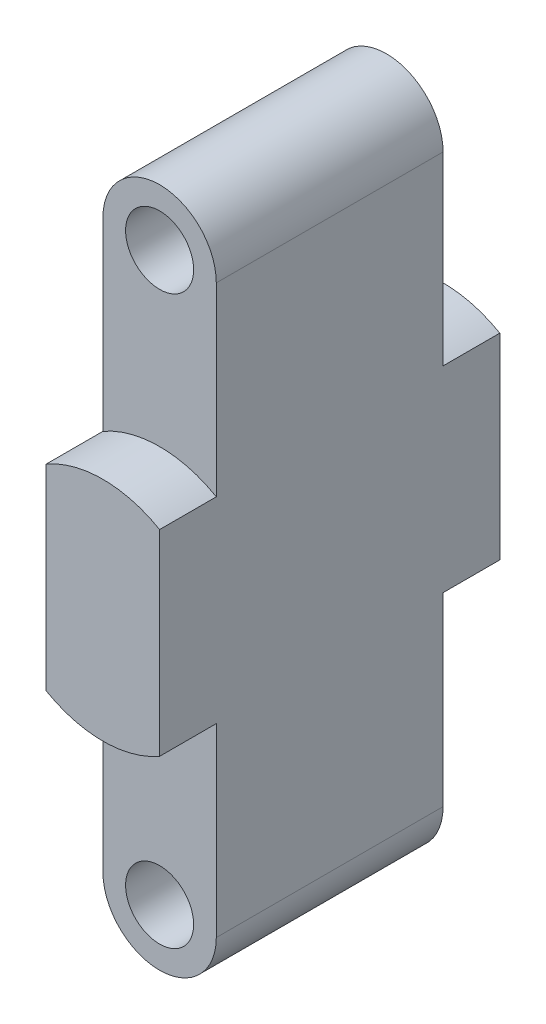
ISO-10303-21;
HEADER;
FILE_DESCRIPTION(('STEP AP214'),'2;1');
FILE_NAME('part.step','',(''),(''),'','','');
FILE_SCHEMA(('AUTOMOTIVE_DESIGN { 1 0 10303 214 1 1 1 1 }'));
ENDSEC;
DATA;
#1=APPLICATION_CONTEXT('core data for automotive mechanical design processes');
#2=APPLICATION_PROTOCOL_DEFINITION('international standard','automotive_design',2000,#1);
#3=PRODUCT_CONTEXT('',#1,'mechanical');
#4=PRODUCT('Part','Part','',(#3));
#5=PRODUCT_RELATED_PRODUCT_CATEGORY('part','',(#4));
#6=PRODUCT_DEFINITION_FORMATION('','',#4);
#7=PRODUCT_DEFINITION_CONTEXT('part definition',#1,'design');
#8=PRODUCT_DEFINITION('design','',#6,#7);
#9=PRODUCT_DEFINITION_SHAPE('','',#8);
#10=(LENGTH_UNIT() NAMED_UNIT(*) SI_UNIT(.MILLI.,.METRE.));
#11=(NAMED_UNIT(*) PLANE_ANGLE_UNIT() SI_UNIT($,.RADIAN.));
#12=(NAMED_UNIT(*) SI_UNIT($,.STERADIAN.) SOLID_ANGLE_UNIT());
#13=UNCERTAINTY_MEASURE_WITH_UNIT(LENGTH_MEASURE(1.E-05),#10,'distance_accuracy_value','');
#14=(GEOMETRIC_REPRESENTATION_CONTEXT(3) GLOBAL_UNCERTAINTY_ASSIGNED_CONTEXT((#13)) GLOBAL_UNIT_ASSIGNED_CONTEXT((#10,
#11,#12)) REPRESENTATION_CONTEXT('',''));
#15=CARTESIAN_POINT('',(0.,0.,0.));
#16=DIRECTION('',(0.,0.,1.));
#17=DIRECTION('',(1.,0.,0.));
#18=AXIS2_PLACEMENT_3D('',#15,#16,#17);
#19=CARTESIAN_POINT('',(0.,50.8,19.05));
#20=DIRECTION('',(0.,0.,-1.));
#21=DIRECTION('',(-1.,0.,0.));
#22=AXIS2_PLACEMENT_3D('',#19,#20,#21);
#23=CYLINDRICAL_SURFACE('',#22,6.35);
#24=DIRECTION('',(0.,0.,1.));
#25=VECTOR('',#24,1.);
#26=CARTESIAN_POINT('',(6.34999999999999,50.8,19.05));
#27=LINE('',#26,#25);
#28=CARTESIAN_POINT('',(6.34999999999999,50.8,-12.7));
#29=VERTEX_POINT('',#28);
#30=CARTESIAN_POINT('',(6.34999999999999,50.8,12.7));
#31=VERTEX_POINT('',#30);
#32=EDGE_CURVE('E45',#29,#31,#27,.T.);
#33=ORIENTED_EDGE('',*,*,#32,.F.);
#34=CARTESIAN_POINT('',(0.,50.8,-12.7));
#35=DIRECTION('',(0.,0.,-1.));
#36=DIRECTION('',(-1.,0.,0.));
#37=AXIS2_PLACEMENT_3D('',#34,#35,#36);
#38=CIRCLE('',#37,6.35);
#39=CARTESIAN_POINT('',(-6.35,50.8,-12.7));
#40=VERTEX_POINT('',#39);
#41=EDGE_CURVE('E257',#29,#40,#38,.F.);
#42=ORIENTED_EDGE('',*,*,#41,.T.);
#43=DIRECTION('',(0.,0.,1.));
#44=VECTOR('',#43,1.);
#45=CARTESIAN_POINT('',(-6.35,50.8,19.05));
#46=LINE('',#45,#44);
#47=CARTESIAN_POINT('',(-6.35,50.8,12.7));
#48=VERTEX_POINT('',#47);
#49=EDGE_CURVE('E168',#48,#40,#46,.F.);
#50=ORIENTED_EDGE('',*,*,#49,.F.);
#51=CARTESIAN_POINT('',(0.,50.8,12.7));
#52=DIRECTION('',(0.,0.,1.));
#53=DIRECTION('',(1.,0.,0.));
#54=AXIS2_PLACEMENT_3D('',#51,#52,#53);
#55=CIRCLE('',#54,6.35);
#56=EDGE_CURVE('E177',#48,#31,#55,.F.);
#57=ORIENTED_EDGE('',*,*,#56,.T.);
#58=EDGE_LOOP('',(#33,#42,#50,#57));
#59=FACE_BOUND('',#58,.T.);
#60=ADVANCED_FACE('F36',(#59),#23,.T.);
#61=CARTESIAN_POINT('',(0.,50.8,-19.05));
#62=DIRECTION('',(0.,0.,1.));
#63=DIRECTION('',(1.,0.,0.));
#64=AXIS2_PLACEMENT_3D('',#61,#62,#63);
#65=CYLINDRICAL_SURFACE('',#64,3.81);
#66=CARTESIAN_POINT('',(0.,50.8,12.7));
#67=DIRECTION('',(0.,0.,1.));
#68=DIRECTION('',(1.,0.,0.));
#69=AXIS2_PLACEMENT_3D('',#66,#67,#68);
#70=CIRCLE('',#69,3.81);
#71=CARTESIAN_POINT('',(3.81,50.8,12.7));
#72=VERTEX_POINT('',#71);
#73=EDGE_CURVE('E171',#72,#72,#70,.T.);
#74=CARTESIAN_POINT('',(0.,50.8,-12.7));
#75=DIRECTION('',(0.,0.,-1.));
#76=DIRECTION('',(-1.,0.,0.));
#77=AXIS2_PLACEMENT_3D('',#74,#75,#76);
#78=CIRCLE('',#77,3.81);
#79=CARTESIAN_POINT('',(3.81,50.8,-12.7));
#80=VERTEX_POINT('',#79);
#81=EDGE_CURVE('E40',#80,#80,#78,.T.);
#82=CARTESIAN_POINT('',(3.81,50.8,12.7));
#83=CARTESIAN_POINT('',(3.81,50.8,12.4354166666667));
#84=CARTESIAN_POINT('',(3.81,50.8,12.1708333333333));
#85=CARTESIAN_POINT('',(3.81,50.8,11.6416666666667));
#86=CARTESIAN_POINT('',(3.81,50.8,11.3770833333333));
#87=CARTESIAN_POINT('',(3.81,50.8,10.8479166666667));
#88=CARTESIAN_POINT('',(3.81,50.8,10.5833333333333));
#89=CARTESIAN_POINT('',(3.81,50.8,10.0541666666667));
#90=CARTESIAN_POINT('',(3.81,50.8,9.78958333333333));
#91=CARTESIAN_POINT('',(3.81,50.8,9.26041666666666));
#92=CARTESIAN_POINT('',(3.81,50.8,8.99583333333333));
#93=CARTESIAN_POINT('',(3.81,50.8,8.46666666666666));
#94=CARTESIAN_POINT('',(3.81,50.8,8.20208333333333));
#95=CARTESIAN_POINT('',(3.81,50.8,7.67291666666666));
#96=CARTESIAN_POINT('',(3.81,50.8,7.40833333333333));
#97=CARTESIAN_POINT('',(3.81,50.8,6.87916666666666));
#98=CARTESIAN_POINT('',(3.81,50.8,6.61458333333333));
#99=CARTESIAN_POINT('',(3.81,50.8,6.08541666666666));
#100=CARTESIAN_POINT('',(3.81,50.8,5.82083333333333));
#101=CARTESIAN_POINT('',(3.81,50.8,5.29166666666666));
#102=CARTESIAN_POINT('',(3.81,50.8,5.02708333333333));
#103=CARTESIAN_POINT('',(3.81,50.8,4.49791666666666));
#104=CARTESIAN_POINT('',(3.81,50.8,4.23333333333333));
#105=CARTESIAN_POINT('',(3.81,50.8,3.70416666666666));
#106=CARTESIAN_POINT('',(3.81,50.8,3.43958333333333));
#107=CARTESIAN_POINT('',(3.81,50.8,2.91041666666666));
#108=CARTESIAN_POINT('',(3.81,50.8,2.64583333333333));
#109=CARTESIAN_POINT('',(3.81,50.8,2.11666666666666));
#110=CARTESIAN_POINT('',(3.81,50.8,1.85208333333333));
#111=CARTESIAN_POINT('',(3.81,50.8,1.32291666666666));
#112=CARTESIAN_POINT('',(3.81,50.8,1.05833333333333));
#113=CARTESIAN_POINT('',(3.81,50.8,0.529166666666663));
#114=CARTESIAN_POINT('',(3.81,50.8,0.26458333333333));
#115=CARTESIAN_POINT('',(3.81,50.8,-0.264583333333337));
#116=CARTESIAN_POINT('',(3.81,50.8,-0.52916666666667));
#117=CARTESIAN_POINT('',(3.81,50.8,-1.05833333333334));
#118=CARTESIAN_POINT('',(3.81,50.8,-1.32291666666667));
#119=CARTESIAN_POINT('',(3.81,50.8,-1.85208333333334));
#120=CARTESIAN_POINT('',(3.81,50.8,-2.11666666666667));
#121=CARTESIAN_POINT('',(3.81,50.8,-2.64583333333334));
#122=CARTESIAN_POINT('',(3.81,50.8,-2.91041666666667));
#123=CARTESIAN_POINT('',(3.81,50.8,-3.43958333333334));
#124=CARTESIAN_POINT('',(3.81,50.8,-3.70416666666667));
#125=CARTESIAN_POINT('',(3.81,50.8,-4.23333333333333));
#126=CARTESIAN_POINT('',(3.81,50.8,-4.49791666666667));
#127=CARTESIAN_POINT('',(3.81,50.8,-5.02708333333333));
#128=CARTESIAN_POINT('',(3.81,50.8,-5.29166666666667));
#129=CARTESIAN_POINT('',(3.81,50.8,-5.82083333333333));
#130=CARTESIAN_POINT('',(3.81,50.8,-6.08541666666667));
#131=CARTESIAN_POINT('',(3.81,50.8,-6.61458333333333));
#132=CARTESIAN_POINT('',(3.81,50.8,-6.87916666666667));
#133=CARTESIAN_POINT('',(3.81,50.8,-7.40833333333333));
#134=CARTESIAN_POINT('',(3.81,50.8,-7.67291666666667));
#135=CARTESIAN_POINT('',(3.81,50.8,-8.20208333333334));
#136=CARTESIAN_POINT('',(3.81,50.8,-8.46666666666667));
#137=CARTESIAN_POINT('',(3.81,50.8,-8.99583333333334));
#138=CARTESIAN_POINT('',(3.81,50.8,-9.26041666666667));
#139=CARTESIAN_POINT('',(3.81,50.8,-9.78958333333333));
#140=CARTESIAN_POINT('',(3.81,50.8,-10.0541666666667));
#141=CARTESIAN_POINT('',(3.81,50.8,-10.5833333333333));
#142=CARTESIAN_POINT('',(3.81,50.8,-10.8479166666667));
#143=CARTESIAN_POINT('',(3.81,50.8,-11.3770833333333));
#144=CARTESIAN_POINT('',(3.81,50.8,-11.6416666666667));
#145=CARTESIAN_POINT('',(3.81,50.8,-12.1708333333333));
#146=CARTESIAN_POINT('',(3.81,50.8,-12.4354166666667));
#147=CARTESIAN_POINT('',(3.81,50.8,-12.7));
#148=B_SPLINE_CURVE_WITH_KNOTS('',3,(#82,#83,#84,#85,#86,#87,#88,#89,#90,#91,#92,#93,#94,#95,
#96,#97,#98,#99,#100,#101,#102,#103,#104,#105,#106,#107,#108,#109,#110,#111,#112,#113,#114,#115,
#116,#117,#118,#119,#120,#121,#122,#123,#124,#125,#126,#127,#128,#129,#130,#131,#132,#133,#134,
#135,#136,#137,#138,#139,#140,#141,#142,#143,#144,#145,#146,#147),.UNSPECIFIED.,.F.,.F.,(4,2,2,
2,2,2,2,2,2,2,2,2,2,2,2,2,2,2,2,2,2,2,2,2,2,2,2,2,2,2,2,2,4),(0.,0.793749999999996,1.5875,
2.38125,3.175,3.96875,4.7625,5.55625,6.35,7.14375,7.9375,8.73125,9.525,10.31875,11.1125,
11.90625,12.7,13.49375,14.2875,15.08125,15.875,16.66875,17.4625,18.25625,19.05,19.84375,20.6375,
21.43125,22.225,23.01875,23.8125,24.60625,25.4),.UNSPECIFIED.);
#149=EDGE_CURVE('BSEAM286',#72,#80,#148,.T.);
#150=ORIENTED_EDGE('',*,*,#73,.T.);
#151=ORIENTED_EDGE('',*,*,#81,.T.);
#152=ORIENTED_EDGE('',*,*,#149,.T.);
#153=ORIENTED_EDGE('',*,*,#149,.F.);
#154=EDGE_LOOP('',(#150,#152,#151,#153));
#155=FACE_BOUND('',#154,.T.);
#156=ADVANCED_FACE('F286',(#155),#65,.F.);
#157=CARTESIAN_POINT('',(0.,0.,-19.05));
#158=DIRECTION('',(0.,0.,1.));
#159=DIRECTION('',(1.,0.,0.));
#160=AXIS2_PLACEMENT_3D('',#157,#158,#159);
#161=PLANE('',#160);
#162=DIRECTION('',(0.,-1.,0.));
#163=VECTOR('',#162,1.);
#164=CARTESIAN_POINT('',(-6.35,19.05,-19.05));
#165=LINE('',#164,#163);
#166=CARTESIAN_POINT('',(-6.35,30.0485226280624,-19.05));
#167=VERTEX_POINT('',#166);
#168=CARTESIAN_POINT('',(-6.35,8.05147737193764,-19.05));
#169=VERTEX_POINT('',#168);
#170=EDGE_CURVE('E136',#167,#169,#165,.T.);
#171=ORIENTED_EDGE('',*,*,#170,.F.);
#172=CARTESIAN_POINT('',(0.,19.05,-19.05));
#173=DIRECTION('',(0.,0.,1.));
#174=DIRECTION('',(1.,0.,0.));
#175=AXIS2_PLACEMENT_3D('',#172,#173,#174);
#176=CIRCLE('',#175,12.7);
#177=CARTESIAN_POINT('',(6.34999999999999,30.0485226280624,-19.05));
#178=VERTEX_POINT('',#177);
#179=EDGE_CURVE('E11',#167,#178,#176,.F.);
#180=ORIENTED_EDGE('',*,*,#179,.T.);
#181=DIRECTION('',(0.,1.,0.));
#182=VECTOR('',#181,1.);
#183=CARTESIAN_POINT('',(6.35,19.05,-19.05));
#184=LINE('',#183,#182);
#185=CARTESIAN_POINT('',(6.35,8.05147737193763,-19.05));
#186=VERTEX_POINT('',#185);
#187=EDGE_CURVE('E146',#186,#178,#184,.T.);
#188=ORIENTED_EDGE('',*,*,#187,.F.);
#189=CARTESIAN_POINT('',(0.,19.05,-19.05));
#190=DIRECTION('',(0.,0.,1.));
#191=DIRECTION('',(1.,0.,0.));
#192=AXIS2_PLACEMENT_3D('',#189,#190,#191);
#193=CIRCLE('',#192,12.7);
#194=EDGE_CURVE('E144',#169,#186,#193,.T.);
#195=ORIENTED_EDGE('',*,*,#194,.F.);
#196=EDGE_LOOP('',(#171,#180,#188,#195));
#197=FACE_BOUND('',#196,.T.);
#198=ADVANCED_FACE('F143',(#197),#161,.F.);
#199=CARTESIAN_POINT('',(6.35,19.05,19.05));
#200=DIRECTION('',(-1.,0.,0.));
#201=DIRECTION('',(0.,-1.,0.));
#202=AXIS2_PLACEMENT_3D('',#199,#200,#201);
#203=PLANE('',#202);
#204=ORIENTED_EDGE('',*,*,#187,.T.);
#205=DIRECTION('',(0.,0.,-1.));
#206=VECTOR('',#205,1.);
#207=CARTESIAN_POINT('',(6.34999999999999,30.0485226280624,-12.7));
#208=LINE('',#207,#206);
#209=CARTESIAN_POINT('',(6.34999999999999,30.0485226280624,-12.7));
#210=VERTEX_POINT('',#209);
#211=EDGE_CURVE('E52',#178,#210,#208,.F.);
#212=ORIENTED_EDGE('',*,*,#211,.T.);
#213=DIRECTION('',(0.,-1.,0.));
#214=VECTOR('',#213,1.);
#215=CARTESIAN_POINT('',(6.35,19.05,-12.7));
#216=LINE('',#215,#214);
#217=EDGE_CURVE('E182',#29,#210,#216,.T.);
#218=ORIENTED_EDGE('',*,*,#217,.F.);
#219=ORIENTED_EDGE('',*,*,#32,.T.);
#220=DIRECTION('',(0.,1.,0.));
#221=VECTOR('',#220,1.);
#222=CARTESIAN_POINT('',(6.35,19.05,12.7));
#223=LINE('',#222,#221);
#224=CARTESIAN_POINT('',(6.34999999999999,30.0485226280624,12.7));
#225=VERTEX_POINT('',#224);
#226=EDGE_CURVE('E189',#225,#31,#223,.T.);
#227=ORIENTED_EDGE('',*,*,#226,.F.);
#228=DIRECTION('',(0.,0.,1.));
#229=VECTOR('',#228,1.);
#230=CARTESIAN_POINT('',(6.34999999999999,30.0485226280624,12.7));
#231=LINE('',#230,#229);
#232=CARTESIAN_POINT('',(6.35,30.0485226280624,19.05));
#233=VERTEX_POINT('',#232);
#234=EDGE_CURVE('E193',#233,#225,#231,.F.);
#235=ORIENTED_EDGE('',*,*,#234,.F.);
#236=DIRECTION('',(0.,1.,0.));
#237=VECTOR('',#236,1.);
#238=CARTESIAN_POINT('',(6.35,19.05,19.05));
#239=LINE('',#238,#237);
#240=CARTESIAN_POINT('',(6.35,8.05147737193763,19.05));
#241=VERTEX_POINT('',#240);
#242=EDGE_CURVE('E145',#241,#233,#239,.T.);
#243=ORIENTED_EDGE('',*,*,#242,.F.);
#244=DIRECTION('',(0.,0.,1.));
#245=VECTOR('',#244,1.);
#246=CARTESIAN_POINT('',(6.35,8.05147737193763,12.7));
#247=LINE('',#246,#245);
#248=CARTESIAN_POINT('',(6.35,8.05147737193763,12.7));
#249=VERTEX_POINT('',#248);
#250=EDGE_CURVE('E151',#241,#249,#247,.F.);
#251=ORIENTED_EDGE('',*,*,#250,.T.);
#252=DIRECTION('',(0.,1.,0.));
#253=VECTOR('',#252,1.);
#254=CARTESIAN_POINT('',(6.35,19.05,12.7));
#255=LINE('',#254,#253);
#256=CARTESIAN_POINT('',(6.35,-12.7,12.7));
#257=VERTEX_POINT('',#256);
#258=EDGE_CURVE('E220',#257,#249,#255,.T.);
#259=ORIENTED_EDGE('',*,*,#258,.F.);
#260=DIRECTION('',(0.,0.,-1.));
#261=VECTOR('',#260,1.);
#262=CARTESIAN_POINT('',(6.35,-12.7,19.05));
#263=LINE('',#262,#261);
#264=CARTESIAN_POINT('',(6.35,-12.7,-12.7));
#265=VERTEX_POINT('',#264);
#266=EDGE_CURVE('E157',#257,#265,#263,.T.);
#267=ORIENTED_EDGE('',*,*,#266,.T.);
#268=DIRECTION('',(0.,-1.,0.));
#269=VECTOR('',#268,1.);
#270=CARTESIAN_POINT('',(6.35,19.05,-12.7));
#271=LINE('',#270,#269);
#272=CARTESIAN_POINT('',(6.35,8.05147737193763,-12.7));
#273=VERTEX_POINT('',#272);
#274=EDGE_CURVE('E205',#273,#265,#271,.T.);
#275=ORIENTED_EDGE('',*,*,#274,.F.);
#276=DIRECTION('',(0.,0.,-1.));
#277=VECTOR('',#276,1.);
#278=CARTESIAN_POINT('',(6.35,8.05147737193763,-12.7));
#279=LINE('',#278,#277);
#280=EDGE_CURVE('E200',#186,#273,#279,.F.);
#281=ORIENTED_EDGE('',*,*,#280,.F.);
#282=EDGE_LOOP('',(#204,#212,#218,#219,#227,#235,#243,#251,#259,#267,#275,#281));
#283=FACE_BOUND('',#282,.T.);
#284=ADVANCED_FACE('F245',(#283),#203,.F.);
#285=CARTESIAN_POINT('',(-6.35,19.05,19.05));
#286=DIRECTION('',(1.,0.,0.));
#287=DIRECTION('',(0.,1.,0.));
#288=AXIS2_PLACEMENT_3D('',#285,#286,#287);
#289=PLANE('',#288);
#290=DIRECTION('',(0.,1.,0.));
#291=VECTOR('',#290,1.);
#292=CARTESIAN_POINT('',(-6.35,19.05,-12.7));
#293=LINE('',#292,#291);
#294=CARTESIAN_POINT('',(-6.35,30.0485226280624,-12.7));
#295=VERTEX_POINT('',#294);
#296=EDGE_CURVE('E139',#295,#40,#293,.T.);
#297=ORIENTED_EDGE('',*,*,#296,.F.);
#298=DIRECTION('',(0.,0.,-1.));
#299=VECTOR('',#298,1.);
#300=CARTESIAN_POINT('',(-6.35,30.0485226280624,-12.7));
#301=LINE('',#300,#299);
#302=EDGE_CURVE('E126',#295,#167,#301,.T.);
#303=ORIENTED_EDGE('',*,*,#302,.T.);
#304=ORIENTED_EDGE('',*,*,#170,.T.);
#305=DIRECTION('',(0.,0.,-1.));
#306=VECTOR('',#305,1.);
#307=CARTESIAN_POINT('',(-6.35,8.05147737193763,-12.7));
#308=LINE('',#307,#306);
#309=CARTESIAN_POINT('',(-6.35,8.05147737193763,-12.7));
#310=VERTEX_POINT('',#309);
#311=EDGE_CURVE('E198',#310,#169,#308,.T.);
#312=ORIENTED_EDGE('',*,*,#311,.F.);
#313=DIRECTION('',(0.,1.,0.));
#314=VECTOR('',#313,1.);
#315=CARTESIAN_POINT('',(-6.35,19.05,-12.7));
#316=LINE('',#315,#314);
#317=CARTESIAN_POINT('',(-6.35,-12.7,-12.7));
#318=VERTEX_POINT('',#317);
#319=EDGE_CURVE('E166',#318,#310,#316,.T.);
#320=ORIENTED_EDGE('',*,*,#319,.F.);
#321=DIRECTION('',(0.,0.,-1.));
#322=VECTOR('',#321,1.);
#323=CARTESIAN_POINT('',(-6.35,-12.7,19.05));
#324=LINE('',#323,#322);
#325=CARTESIAN_POINT('',(-6.35,-12.7,12.7));
#326=VERTEX_POINT('',#325);
#327=EDGE_CURVE('E155',#318,#326,#324,.F.);
#328=ORIENTED_EDGE('',*,*,#327,.T.);
#329=DIRECTION('',(0.,-1.,0.));
#330=VECTOR('',#329,1.);
#331=CARTESIAN_POINT('',(-6.35,19.05,12.7));
#332=LINE('',#331,#330);
#333=CARTESIAN_POINT('',(-6.35,8.05147737193763,12.7));
#334=VERTEX_POINT('',#333);
#335=EDGE_CURVE('E163',#334,#326,#332,.T.);
#336=ORIENTED_EDGE('',*,*,#335,.F.);
#337=DIRECTION('',(0.,0.,1.));
#338=VECTOR('',#337,1.);
#339=CARTESIAN_POINT('',(-6.35,8.05147737193763,12.7));
#340=LINE('',#339,#338);
#341=CARTESIAN_POINT('',(-6.35,8.05147737193763,19.05));
#342=VERTEX_POINT('',#341);
#343=EDGE_CURVE('E222',#334,#342,#340,.T.);
#344=ORIENTED_EDGE('',*,*,#343,.T.);
#345=DIRECTION('',(0.,-1.,0.));
#346=VECTOR('',#345,1.);
#347=CARTESIAN_POINT('',(-6.35,19.05,19.05));
#348=LINE('',#347,#346);
#349=CARTESIAN_POINT('',(-6.35,30.0485226280624,19.05));
#350=VERTEX_POINT('',#349);
#351=EDGE_CURVE('E149',#350,#342,#348,.T.);
#352=ORIENTED_EDGE('',*,*,#351,.F.);
#353=DIRECTION('',(0.,0.,1.));
#354=VECTOR('',#353,1.);
#355=CARTESIAN_POINT('',(-6.35,30.0485226280624,12.7));
#356=LINE('',#355,#354);
#357=CARTESIAN_POINT('',(-6.35,30.0485226280624,12.7));
#358=VERTEX_POINT('',#357);
#359=EDGE_CURVE('E59',#358,#350,#356,.T.);
#360=ORIENTED_EDGE('',*,*,#359,.F.);
#361=DIRECTION('',(0.,-1.,0.));
#362=VECTOR('',#361,1.);
#363=CARTESIAN_POINT('',(-6.35,19.05,12.7));
#364=LINE('',#363,#362);
#365=EDGE_CURVE('E173',#48,#358,#364,.T.);
#366=ORIENTED_EDGE('',*,*,#365,.F.);
#367=ORIENTED_EDGE('',*,*,#49,.T.);
#368=EDGE_LOOP('',(#297,#303,#304,#312,#320,#328,#336,#344,#352,#360,#366,#367));
#369=FACE_BOUND('',#368,.T.);
#370=ADVANCED_FACE('F134',(#369),#289,.F.);
#371=CARTESIAN_POINT('',(0.,0.,19.05));
#372=DIRECTION('',(0.,0.,1.));
#373=DIRECTION('',(1.,0.,0.));
#374=AXIS2_PLACEMENT_3D('',#371,#372,#373);
#375=PLANE('',#374);
#376=ORIENTED_EDGE('',*,*,#242,.T.);
#377=CARTESIAN_POINT('',(0.,19.05,19.05));
#378=DIRECTION('',(0.,0.,1.));
#379=DIRECTION('',(1.,0.,0.));
#380=AXIS2_PLACEMENT_3D('',#377,#378,#379);
#381=CIRCLE('',#380,12.7);
#382=EDGE_CURVE('E179',#233,#350,#381,.T.);
#383=ORIENTED_EDGE('',*,*,#382,.T.);
#384=ORIENTED_EDGE('',*,*,#351,.T.);
#385=CARTESIAN_POINT('',(0.,19.05,19.05));
#386=DIRECTION('',(0.,0.,-1.));
#387=DIRECTION('',(1.,0.,0.));
#388=AXIS2_PLACEMENT_3D('',#385,#386,#387);
#389=CIRCLE('',#388,12.7);
#390=EDGE_CURVE('E210',#241,#342,#389,.T.);
#391=ORIENTED_EDGE('',*,*,#390,.F.);
#392=EDGE_LOOP('',(#376,#383,#384,#391));
#393=FACE_BOUND('',#392,.T.);
#394=ADVANCED_FACE('F229',(#393),#375,.T.);
#395=CARTESIAN_POINT('',(0.,-12.7,-19.05));
#396=DIRECTION('',(0.,0.,-1.));
#397=DIRECTION('',(-1.,0.,0.));
#398=AXIS2_PLACEMENT_3D('',#395,#396,#397);
#399=CYLINDRICAL_SURFACE('',#398,6.35);
#400=ORIENTED_EDGE('',*,*,#327,.F.);
#401=CARTESIAN_POINT('',(0.,-12.7,-12.7));
#402=DIRECTION('',(0.,0.,-1.));
#403=DIRECTION('',(-1.,0.,0.));
#404=AXIS2_PLACEMENT_3D('',#401,#402,#403);
#405=CIRCLE('',#404,6.35);
#406=EDGE_CURVE('E202',#318,#265,#405,.F.);
#407=ORIENTED_EDGE('',*,*,#406,.T.);
#408=ORIENTED_EDGE('',*,*,#266,.F.);
#409=CARTESIAN_POINT('',(0.,-12.7,12.7));
#410=DIRECTION('',(0.,0.,1.));
#411=DIRECTION('',(1.,0.,0.));
#412=AXIS2_PLACEMENT_3D('',#409,#410,#411);
#413=CIRCLE('',#412,6.35);
#414=EDGE_CURVE('E217',#257,#326,#413,.F.);
#415=ORIENTED_EDGE('',*,*,#414,.T.);
#416=EDGE_LOOP('',(#400,#407,#408,#415));
#417=FACE_BOUND('',#416,.T.);
#418=ADVANCED_FACE('F242',(#417),#399,.T.);
#419=CARTESIAN_POINT('',(0.,-12.7,-19.05));
#420=DIRECTION('',(0.,0.,1.));
#421=DIRECTION('',(1.,0.,0.));
#422=AXIS2_PLACEMENT_3D('',#419,#420,#421);
#423=CYLINDRICAL_SURFACE('',#422,3.81);
#424=CARTESIAN_POINT('',(0.,-12.7,12.7));
#425=DIRECTION('',(0.,0.,1.));
#426=DIRECTION('',(1.,0.,0.));
#427=AXIS2_PLACEMENT_3D('',#424,#425,#426);
#428=CIRCLE('',#427,3.81);
#429=CARTESIAN_POINT('',(3.81,-12.7,12.7));
#430=VERTEX_POINT('',#429);
#431=EDGE_CURVE('E160',#430,#430,#428,.F.);
#432=CARTESIAN_POINT('',(0.,-12.7,-12.7));
#433=DIRECTION('',(0.,0.,-1.));
#434=DIRECTION('',(-1.,0.,0.));
#435=AXIS2_PLACEMENT_3D('',#432,#433,#434);
#436=CIRCLE('',#435,3.81);
#437=CARTESIAN_POINT('',(3.81,-12.7,-12.7));
#438=VERTEX_POINT('',#437);
#439=EDGE_CURVE('E207',#438,#438,#436,.F.);
#440=CARTESIAN_POINT('',(3.81,-12.7,12.7));
#441=CARTESIAN_POINT('',(3.81,-12.7,12.4354166666667));
#442=CARTESIAN_POINT('',(3.81,-12.7,12.1708333333333));
#443=CARTESIAN_POINT('',(3.81,-12.7,11.6416666666667));
#444=CARTESIAN_POINT('',(3.81,-12.7,11.3770833333333));
#445=CARTESIAN_POINT('',(3.81,-12.7,10.8479166666667));
#446=CARTESIAN_POINT('',(3.81,-12.7,10.5833333333333));
#447=CARTESIAN_POINT('',(3.81,-12.7,10.0541666666667));
#448=CARTESIAN_POINT('',(3.81,-12.7,9.78958333333333));
#449=CARTESIAN_POINT('',(3.81,-12.7,9.26041666666666));
#450=CARTESIAN_POINT('',(3.81,-12.7,8.99583333333333));
#451=CARTESIAN_POINT('',(3.81,-12.7,8.46666666666666));
#452=CARTESIAN_POINT('',(3.81,-12.7,8.20208333333333));
#453=CARTESIAN_POINT('',(3.81,-12.7,7.67291666666666));
#454=CARTESIAN_POINT('',(3.81,-12.7,7.40833333333333));
#455=CARTESIAN_POINT('',(3.81,-12.7,6.87916666666666));
#456=CARTESIAN_POINT('',(3.81,-12.7,6.61458333333333));
#457=CARTESIAN_POINT('',(3.81,-12.7,6.08541666666666));
#458=CARTESIAN_POINT('',(3.81,-12.7,5.82083333333333));
#459=CARTESIAN_POINT('',(3.81,-12.7,5.29166666666666));
#460=CARTESIAN_POINT('',(3.81,-12.7,5.02708333333333));
#461=CARTESIAN_POINT('',(3.81,-12.7,4.49791666666666));
#462=CARTESIAN_POINT('',(3.81,-12.7,4.23333333333333));
#463=CARTESIAN_POINT('',(3.81,-12.7,3.70416666666666));
#464=CARTESIAN_POINT('',(3.81,-12.7,3.43958333333333));
#465=CARTESIAN_POINT('',(3.81,-12.7,2.91041666666666));
#466=CARTESIAN_POINT('',(3.81,-12.7,2.64583333333333));
#467=CARTESIAN_POINT('',(3.81,-12.7,2.11666666666666));
#468=CARTESIAN_POINT('',(3.81,-12.7,1.85208333333333));
#469=CARTESIAN_POINT('',(3.81,-12.7,1.32291666666666));
#470=CARTESIAN_POINT('',(3.81,-12.7,1.05833333333333));
#471=CARTESIAN_POINT('',(3.81,-12.7,0.529166666666663));
#472=CARTESIAN_POINT('',(3.81,-12.7,0.26458333333333));
#473=CARTESIAN_POINT('',(3.81,-12.7,-0.264583333333337));
#474=CARTESIAN_POINT('',(3.81,-12.7,-0.52916666666667));
#475=CARTESIAN_POINT('',(3.81,-12.7,-1.05833333333334));
#476=CARTESIAN_POINT('',(3.81,-12.7,-1.32291666666667));
#477=CARTESIAN_POINT('',(3.81,-12.7,-1.85208333333334));
#478=CARTESIAN_POINT('',(3.81,-12.7,-2.11666666666667));
#479=CARTESIAN_POINT('',(3.81,-12.7,-2.64583333333334));
#480=CARTESIAN_POINT('',(3.81,-12.7,-2.91041666666667));
#481=CARTESIAN_POINT('',(3.81,-12.7,-3.43958333333334));
#482=CARTESIAN_POINT('',(3.81,-12.7,-3.70416666666667));
#483=CARTESIAN_POINT('',(3.81,-12.7,-4.23333333333333));
#484=CARTESIAN_POINT('',(3.81,-12.7,-4.49791666666667));
#485=CARTESIAN_POINT('',(3.81,-12.7,-5.02708333333333));
#486=CARTESIAN_POINT('',(3.81,-12.7,-5.29166666666667));
#487=CARTESIAN_POINT('',(3.81,-12.7,-5.82083333333333));
#488=CARTESIAN_POINT('',(3.81,-12.7,-6.08541666666667));
#489=CARTESIAN_POINT('',(3.81,-12.7,-6.61458333333333));
#490=CARTESIAN_POINT('',(3.81,-12.7,-6.87916666666667));
#491=CARTESIAN_POINT('',(3.81,-12.7,-7.40833333333333));
#492=CARTESIAN_POINT('',(3.81,-12.7,-7.67291666666667));
#493=CARTESIAN_POINT('',(3.81,-12.7,-8.20208333333334));
#494=CARTESIAN_POINT('',(3.81,-12.7,-8.46666666666667));
#495=CARTESIAN_POINT('',(3.81,-12.7,-8.99583333333334));
#496=CARTESIAN_POINT('',(3.81,-12.7,-9.26041666666667));
#497=CARTESIAN_POINT('',(3.81,-12.7,-9.78958333333333));
#498=CARTESIAN_POINT('',(3.81,-12.7,-10.0541666666667));
#499=CARTESIAN_POINT('',(3.81,-12.7,-10.5833333333333));
#500=CARTESIAN_POINT('',(3.81,-12.7,-10.8479166666667));
#501=CARTESIAN_POINT('',(3.81,-12.7,-11.3770833333333));
#502=CARTESIAN_POINT('',(3.81,-12.7,-11.6416666666667));
#503=CARTESIAN_POINT('',(3.81,-12.7,-12.1708333333333));
#504=CARTESIAN_POINT('',(3.81,-12.7,-12.4354166666667));
#505=CARTESIAN_POINT('',(3.81,-12.7,-12.7));
#506=B_SPLINE_CURVE_WITH_KNOTS('',3,(#440,#441,#442,#443,#444,#445,#446,#447,#448,#449,#450,
#451,#452,#453,#454,#455,#456,#457,#458,#459,#460,#461,#462,#463,#464,#465,#466,#467,#468,#469,
#470,#471,#472,#473,#474,#475,#476,#477,#478,#479,#480,#481,#482,#483,#484,#485,#486,#487,#488,
#489,#490,#491,#492,#493,#494,#495,#496,#497,#498,#499,#500,#501,#502,#503,#504,#505),
.UNSPECIFIED.,.F.,.F.,(4,2,2,2,2,2,2,2,2,2,2,2,2,2,2,2,2,2,2,2,2,2,2,2,2,2,2,2,2,2,2,2,4),(0.,
0.793749999999996,1.5875,2.38125,3.175,3.96875,4.7625,5.55625,6.35,7.14375,7.9375,8.73125,9.525,
10.31875,11.1125,11.90625,12.7,13.49375,14.2875,15.08125,15.875,16.66875,17.4625,18.25625,19.05,
19.84375,20.6375,21.43125,22.225,23.01875,23.8125,24.60625,25.4),.UNSPECIFIED.);
#507=EDGE_CURVE('BSEAM274',#430,#438,#506,.T.);
#508=ORIENTED_EDGE('',*,*,#431,.F.);
#509=ORIENTED_EDGE('',*,*,#439,.F.);
#510=ORIENTED_EDGE('',*,*,#507,.T.);
#511=ORIENTED_EDGE('',*,*,#507,.F.);
#512=EDGE_LOOP('',(#508,#510,#509,#511));
#513=FACE_BOUND('',#512,.T.);
#514=ADVANCED_FACE('F274',(#513),#423,.F.);
#515=CARTESIAN_POINT('',(0.,19.05,12.7));
#516=DIRECTION('',(0.,0.,1.));
#517=DIRECTION('',(1.,0.,0.));
#518=AXIS2_PLACEMENT_3D('',#515,#516,#517);
#519=CYLINDRICAL_SURFACE('',#518,12.7);
#520=ORIENTED_EDGE('',*,*,#390,.T.);
#521=ORIENTED_EDGE('',*,*,#343,.F.);
#522=CARTESIAN_POINT('',(0.,19.05,12.7));
#523=DIRECTION('',(0.,0.,-1.));
#524=DIRECTION('',(1.,0.,0.));
#525=AXIS2_PLACEMENT_3D('',#522,#523,#524);
#526=CIRCLE('',#525,12.7);
#527=EDGE_CURVE('E164',#249,#334,#526,.T.);
#528=ORIENTED_EDGE('',*,*,#527,.F.);
#529=ORIENTED_EDGE('',*,*,#250,.F.);
#530=EDGE_LOOP('',(#520,#521,#528,#529));
#531=FACE_BOUND('',#530,.T.);
#532=ADVANCED_FACE('F232',(#531),#519,.T.);
#533=CARTESIAN_POINT('',(0.,19.05,12.7));
#534=DIRECTION('',(0.,0.,1.));
#535=DIRECTION('',(1.,0.,0.));
#536=AXIS2_PLACEMENT_3D('',#533,#534,#535);
#537=PLANE('',#536);
#538=ORIENTED_EDGE('',*,*,#431,.T.);
#539=EDGE_LOOP('',(#538));
#540=FACE_BOUND('',#539,.T.);
#541=ORIENTED_EDGE('',*,*,#258,.T.);
#542=ORIENTED_EDGE('',*,*,#527,.T.);
#543=ORIENTED_EDGE('',*,*,#335,.T.);
#544=ORIENTED_EDGE('',*,*,#414,.F.);
#545=EDGE_LOOP('',(#541,#542,#543,#544));
#546=FACE_BOUND('',#545,.T.);
#547=ADVANCED_FACE('F238',(#540,#546),#537,.T.);
#548=CARTESIAN_POINT('',(0.,19.05,-12.7));
#549=DIRECTION('',(0.,0.,-1.));
#550=DIRECTION('',(1.,0.,0.));
#551=AXIS2_PLACEMENT_3D('',#548,#549,#550);
#552=PLANE('',#551);
#553=ORIENTED_EDGE('',*,*,#274,.T.);
#554=ORIENTED_EDGE('',*,*,#406,.F.);
#555=ORIENTED_EDGE('',*,*,#319,.T.);
#556=CARTESIAN_POINT('',(0.,19.05,-12.7));
#557=DIRECTION('',(0.,0.,-1.));
#558=DIRECTION('',(1.,0.,0.));
#559=AXIS2_PLACEMENT_3D('',#556,#557,#558);
#560=CIRCLE('',#559,12.7);
#561=EDGE_CURVE('E195',#273,#310,#560,.T.);
#562=ORIENTED_EDGE('',*,*,#561,.F.);
#563=EDGE_LOOP('',(#553,#554,#555,#562));
#564=FACE_BOUND('',#563,.T.);
#565=ORIENTED_EDGE('',*,*,#439,.T.);
#566=EDGE_LOOP('',(#565));
#567=FACE_BOUND('',#566,.T.);
#568=ADVANCED_FACE('F268',(#564,#567),#552,.T.);
#569=CARTESIAN_POINT('',(0.,19.05,-12.7));
#570=DIRECTION('',(0.,0.,-1.));
#571=DIRECTION('',(-1.,0.,0.));
#572=AXIS2_PLACEMENT_3D('',#569,#570,#571);
#573=CYLINDRICAL_SURFACE('',#572,12.7);
#574=ORIENTED_EDGE('',*,*,#280,.T.);
#575=ORIENTED_EDGE('',*,*,#561,.T.);
#576=ORIENTED_EDGE('',*,*,#311,.T.);
#577=ORIENTED_EDGE('',*,*,#194,.T.);
#578=EDGE_LOOP('',(#574,#575,#576,#577));
#579=FACE_BOUND('',#578,.T.);
#580=ADVANCED_FACE('F266',(#579),#573,.T.);
#581=CARTESIAN_POINT('',(0.,19.05,12.7));
#582=DIRECTION('',(0.,0.,1.));
#583=DIRECTION('',(1.,0.,0.));
#584=AXIS2_PLACEMENT_3D('',#581,#582,#583);
#585=CYLINDRICAL_SURFACE('',#584,12.7);
#586=ORIENTED_EDGE('',*,*,#234,.T.);
#587=CARTESIAN_POINT('',(0.,19.05,12.7));
#588=DIRECTION('',(0.,0.,1.));
#589=DIRECTION('',(1.,0.,0.));
#590=AXIS2_PLACEMENT_3D('',#587,#588,#589);
#591=CIRCLE('',#590,12.7);
#592=EDGE_CURVE('E174',#225,#358,#591,.T.);
#593=ORIENTED_EDGE('',*,*,#592,.T.);
#594=ORIENTED_EDGE('',*,*,#359,.T.);
#595=ORIENTED_EDGE('',*,*,#382,.F.);
#596=EDGE_LOOP('',(#586,#593,#594,#595));
#597=FACE_BOUND('',#596,.T.);
#598=ADVANCED_FACE('F249',(#597),#585,.T.);
#599=CARTESIAN_POINT('',(0.,19.05,12.7));
#600=DIRECTION('',(0.,0.,1.));
#601=DIRECTION('',(1.,0.,0.));
#602=AXIS2_PLACEMENT_3D('',#599,#600,#601);
#603=PLANE('',#602);
#604=ORIENTED_EDGE('',*,*,#73,.F.);
#605=EDGE_LOOP('',(#604));
#606=FACE_BOUND('',#605,.T.);
#607=ORIENTED_EDGE('',*,*,#226,.T.);
#608=ORIENTED_EDGE('',*,*,#56,.F.);
#609=ORIENTED_EDGE('',*,*,#365,.T.);
#610=ORIENTED_EDGE('',*,*,#592,.F.);
#611=EDGE_LOOP('',(#607,#608,#609,#610));
#612=FACE_BOUND('',#611,.T.);
#613=ADVANCED_FACE('F251',(#606,#612),#603,.T.);
#614=CARTESIAN_POINT('',(0.,19.05,-12.7));
#615=DIRECTION('',(0.,0.,-1.));
#616=DIRECTION('',(1.,0.,0.));
#617=AXIS2_PLACEMENT_3D('',#614,#615,#616);
#618=PLANE('',#617);
#619=ORIENTED_EDGE('',*,*,#81,.F.);
#620=EDGE_LOOP('',(#619));
#621=FACE_BOUND('',#620,.T.);
#622=ORIENTED_EDGE('',*,*,#217,.T.);
#623=CARTESIAN_POINT('',(0.,19.05,-12.7));
#624=DIRECTION('',(0.,0.,1.));
#625=DIRECTION('',(1.,0.,0.));
#626=AXIS2_PLACEMENT_3D('',#623,#624,#625);
#627=CIRCLE('',#626,12.7);
#628=EDGE_CURVE('E140',#210,#295,#627,.T.);
#629=ORIENTED_EDGE('',*,*,#628,.T.);
#630=ORIENTED_EDGE('',*,*,#296,.T.);
#631=ORIENTED_EDGE('',*,*,#41,.F.);
#632=EDGE_LOOP('',(#622,#629,#630,#631));
#633=FACE_BOUND('',#632,.T.);
#634=ADVANCED_FACE('F263',(#621,#633),#618,.T.);
#635=CARTESIAN_POINT('',(0.,19.05,-12.7));
#636=DIRECTION('',(0.,0.,-1.));
#637=DIRECTION('',(-1.,0.,0.));
#638=AXIS2_PLACEMENT_3D('',#635,#636,#637);
#639=CYLINDRICAL_SURFACE('',#638,12.7);
#640=ORIENTED_EDGE('',*,*,#179,.F.);
#641=ORIENTED_EDGE('',*,*,#302,.F.);
#642=ORIENTED_EDGE('',*,*,#628,.F.);
#643=ORIENTED_EDGE('',*,*,#211,.F.);
#644=EDGE_LOOP('',(#640,#641,#642,#643));
#645=FACE_BOUND('',#644,.T.);
#646=ADVANCED_FACE('F125',(#645),#639,.T.);
#647=CLOSED_SHELL('',(#60,#156,#198,#284,#370,#394,#418,#514,#532,#547,#568,#580,#598,#613,#634,#646));
#648=MANIFOLD_SOLID_BREP('B2',#647);
#649=ADVANCED_BREP_SHAPE_REPRESENTATION('',(#18,#648),#14);
#650=SHAPE_DEFINITION_REPRESENTATION(#9,#649);
ENDSEC;
END-ISO-10303-21;
